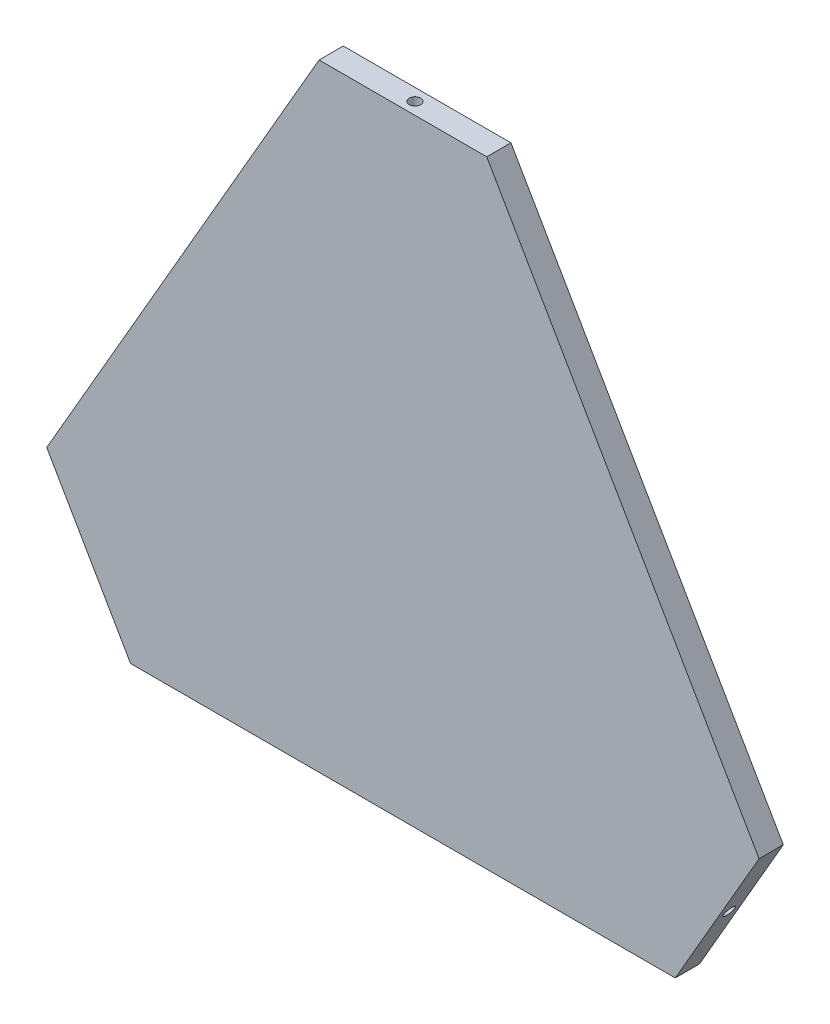
ISO-10303-21;
HEADER;
FILE_DESCRIPTION(('STEP AP214'),'2;1');
FILE_NAME('part.step','',(''),(''),'','','');
FILE_SCHEMA(('AUTOMOTIVE_DESIGN { 1 0 10303 214 1 1 1 1 }'));
ENDSEC;
DATA;
#1=APPLICATION_CONTEXT('core data for automotive mechanical design processes');
#2=APPLICATION_PROTOCOL_DEFINITION('international standard','automotive_design',2000,#1);
#3=PRODUCT_CONTEXT('',#1,'mechanical');
#4=PRODUCT('Part','Part','',(#3));
#5=PRODUCT_RELATED_PRODUCT_CATEGORY('part','',(#4));
#6=PRODUCT_DEFINITION_FORMATION('','',#4);
#7=PRODUCT_DEFINITION_CONTEXT('part definition',#1,'design');
#8=PRODUCT_DEFINITION('design','',#6,#7);
#9=PRODUCT_DEFINITION_SHAPE('','',#8);
#10=(LENGTH_UNIT() NAMED_UNIT(*) SI_UNIT(.MILLI.,.METRE.));
#11=(NAMED_UNIT(*) PLANE_ANGLE_UNIT() SI_UNIT($,.RADIAN.));
#12=(NAMED_UNIT(*) SI_UNIT($,.STERADIAN.) SOLID_ANGLE_UNIT());
#13=UNCERTAINTY_MEASURE_WITH_UNIT(LENGTH_MEASURE(1.E-05),#10,'distance_accuracy_value','');
#14=(GEOMETRIC_REPRESENTATION_CONTEXT(3) GLOBAL_UNCERTAINTY_ASSIGNED_CONTEXT((#13)) GLOBAL_UNIT_ASSIGNED_CONTEXT((#10,
#11,#12)) REPRESENTATION_CONTEXT('',''));
#15=CARTESIAN_POINT('',(0.,0.,0.));
#16=DIRECTION('',(0.,0.,1.));
#17=DIRECTION('',(1.,0.,0.));
#18=AXIS2_PLACEMENT_3D('',#15,#16,#17);
#19=CARTESIAN_POINT('',(0.,200.,6.35));
#20=DIRECTION('',(0.866025403784439,-0.5,0.));
#21=DIRECTION('',(0.5,0.866025403784439,0.));
#22=AXIS2_PLACEMENT_3D('',#19,#20,#21);
#23=PLANE('',#22);
#24=DIRECTION('',(-0.5,-0.866025403784439,0.));
#25=VECTOR('',#24,1.);
#26=CARTESIAN_POINT('',(0.,200.,0.));
#27=LINE('',#26,#25);
#28=CARTESIAN_POINT('',(-22.,161.894882233485,0.));
#29=VERTEX_POINT('',#28);
#30=CARTESIAN_POINT('',(-93.4700538379252,38.1051177665154,0.));
#31=VERTEX_POINT('',#30);
#32=EDGE_CURVE('E119',#29,#31,#27,.T.);
#33=ORIENTED_EDGE('',*,*,#32,.T.);
#34=DIRECTION('',(0.,0.,1.));
#35=VECTOR('',#34,1.);
#36=CARTESIAN_POINT('',(-93.4700538379252,38.1051177665153,0.));
#37=LINE('',#36,#35);
#38=CARTESIAN_POINT('',(-93.4700538379252,38.1051177665153,6.35));
#39=VERTEX_POINT('',#38);
#40=EDGE_CURVE('E99',#31,#39,#37,.T.);
#41=ORIENTED_EDGE('',*,*,#40,.T.);
#42=DIRECTION('',(-0.5,-0.866025403784439,0.));
#43=VECTOR('',#42,1.);
#44=CARTESIAN_POINT('',(0.,200.,6.35));
#45=LINE('',#44,#43);
#46=CARTESIAN_POINT('',(-22.,161.894882233485,6.35));
#47=VERTEX_POINT('',#46);
#48=EDGE_CURVE('E123',#47,#39,#45,.T.);
#49=ORIENTED_EDGE('',*,*,#48,.F.);
#50=DIRECTION('',(0.,0.,1.));
#51=VECTOR('',#50,1.);
#52=CARTESIAN_POINT('',(-22.,161.894882233485,0.));
#53=LINE('',#52,#51);
#54=EDGE_CURVE('E131',#29,#47,#53,.T.);
#55=ORIENTED_EDGE('',*,*,#54,.F.);
#56=EDGE_LOOP('',(#33,#41,#49,#55));
#57=FACE_BOUND('',#56,.T.);
#58=ADVANCED_FACE('F39',(#57),#23,.F.);
#59=CARTESIAN_POINT('',(-115.470053837925,0.,6.35));
#60=DIRECTION('',(0.,1.,0.));
#61=DIRECTION('',(-1.,0.,0.));
#62=AXIS2_PLACEMENT_3D('',#59,#60,#61);
#63=PLANE('',#62);
#64=DIRECTION('',(1.,0.,0.));
#65=VECTOR('',#64,1.);
#66=CARTESIAN_POINT('',(-115.470053837925,0.,6.35));
#67=LINE('',#66,#65);
#68=CARTESIAN_POINT('',(-71.4700538379252,0.,6.35));
#69=VERTEX_POINT('',#68);
#70=CARTESIAN_POINT('',(71.4700538379251,0.,6.35));
#71=VERTEX_POINT('',#70);
#72=EDGE_CURVE('E48',#69,#71,#67,.T.);
#73=ORIENTED_EDGE('',*,*,#72,.F.);
#74=DIRECTION('',(0.,0.,1.));
#75=VECTOR('',#74,1.);
#76=CARTESIAN_POINT('',(-71.4700538379252,0.,0.));
#77=LINE('',#76,#75);
#78=CARTESIAN_POINT('',(-71.4700538379252,0.,0.));
#79=VERTEX_POINT('',#78);
#80=EDGE_CURVE('E96',#79,#69,#77,.T.);
#81=ORIENTED_EDGE('',*,*,#80,.F.);
#82=DIRECTION('',(1.,0.,0.));
#83=VECTOR('',#82,1.);
#84=CARTESIAN_POINT('',(-115.470053837925,0.,0.));
#85=LINE('',#84,#83);
#86=CARTESIAN_POINT('',(71.470053837925,0.,0.));
#87=VERTEX_POINT('',#86);
#88=EDGE_CURVE('E111',#79,#87,#85,.T.);
#89=ORIENTED_EDGE('',*,*,#88,.T.);
#90=DIRECTION('',(0.,0.,1.));
#91=VECTOR('',#90,1.);
#92=CARTESIAN_POINT('',(71.4700538379251,0.,0.));
#93=LINE('',#92,#91);
#94=EDGE_CURVE('E56',#87,#71,#93,.T.);
#95=ORIENTED_EDGE('',*,*,#94,.T.);
#96=EDGE_LOOP('',(#73,#81,#89,#95));
#97=FACE_BOUND('',#96,.T.);
#98=ADVANCED_FACE('F110',(#97),#63,.F.);
#99=CARTESIAN_POINT('',(115.470053837925,0.,6.35));
#100=DIRECTION('',(-0.866025403784439,-0.5,0.));
#101=DIRECTION('',(0.5,-0.866025403784439,0.));
#102=AXIS2_PLACEMENT_3D('',#99,#100,#101);
#103=PLANE('',#102);
#104=DIRECTION('',(-0.5,0.866025403784439,0.));
#105=VECTOR('',#104,1.);
#106=CARTESIAN_POINT('',(115.470053837925,0.,6.35));
#107=LINE('',#106,#105);
#108=CARTESIAN_POINT('',(93.4700538379251,38.1051177665153,6.35));
#109=VERTEX_POINT('',#108);
#110=CARTESIAN_POINT('',(22.,161.894882233485,6.35));
#111=VERTEX_POINT('',#110);
#112=EDGE_CURVE('E11',#109,#111,#107,.T.);
#113=ORIENTED_EDGE('',*,*,#112,.F.);
#114=DIRECTION('',(0.,0.,1.));
#115=VECTOR('',#114,1.);
#116=CARTESIAN_POINT('',(93.4700538379251,38.1051177665153,0.));
#117=LINE('',#116,#115);
#118=CARTESIAN_POINT('',(93.4700538379251,38.1051177665153,0.));
#119=VERTEX_POINT('',#118);
#120=EDGE_CURVE('E144',#119,#109,#117,.T.);
#121=ORIENTED_EDGE('',*,*,#120,.F.);
#122=DIRECTION('',(-0.5,0.866025403784439,0.));
#123=VECTOR('',#122,1.);
#124=CARTESIAN_POINT('',(115.470053837925,0.,0.));
#125=LINE('',#124,#123);
#126=CARTESIAN_POINT('',(22.,161.894882233485,0.));
#127=VERTEX_POINT('',#126);
#128=EDGE_CURVE('E42',#119,#127,#125,.T.);
#129=ORIENTED_EDGE('',*,*,#128,.T.);
#130=DIRECTION('',(0.,0.,1.));
#131=VECTOR('',#130,1.);
#132=CARTESIAN_POINT('',(22.,161.894882233485,0.));
#133=LINE('',#132,#131);
#134=EDGE_CURVE('E64',#127,#111,#133,.T.);
#135=ORIENTED_EDGE('',*,*,#134,.T.);
#136=EDGE_LOOP('',(#113,#121,#129,#135));
#137=FACE_BOUND('',#136,.T.);
#138=ADVANCED_FACE('F204',(#137),#103,.F.);
#139=CARTESIAN_POINT('',(0.,0.,6.35));
#140=DIRECTION('',(0.,0.,1.));
#141=DIRECTION('',(1.,0.,0.));
#142=AXIS2_PLACEMENT_3D('',#139,#140,#141);
#143=PLANE('',#142);
#144=DIRECTION('',(-0.5,0.866025403784439,0.));
#145=VECTOR('',#144,1.);
#146=CARTESIAN_POINT('',(-93.4700538379252,38.1051177665153,6.35));
#147=LINE('',#146,#145);
#148=EDGE_CURVE('E105',#69,#39,#147,.T.);
#149=ORIENTED_EDGE('',*,*,#148,.F.);
#150=ORIENTED_EDGE('',*,*,#72,.T.);
#151=DIRECTION('',(-0.500000000000001,-0.866025403784438,0.));
#152=VECTOR('',#151,1.);
#153=CARTESIAN_POINT('',(71.4700538379251,0.,6.35));
#154=LINE('',#153,#152);
#155=EDGE_CURVE('E137',#109,#71,#154,.T.);
#156=ORIENTED_EDGE('',*,*,#155,.F.);
#157=ORIENTED_EDGE('',*,*,#112,.T.);
#158=DIRECTION('',(1.,0.,0.));
#159=VECTOR('',#158,1.);
#160=CARTESIAN_POINT('',(-22.,161.894882233485,6.35));
#161=LINE('',#160,#159);
#162=EDGE_CURVE('E138',#47,#111,#161,.T.);
#163=ORIENTED_EDGE('',*,*,#162,.F.);
#164=ORIENTED_EDGE('',*,*,#48,.T.);
#165=EDGE_LOOP('',(#149,#150,#156,#157,#163,#164));
#166=FACE_BOUND('',#165,.T.);
#167=ADVANCED_FACE('F198',(#166),#143,.T.);
#168=CARTESIAN_POINT('',(0.,0.,0.));
#169=DIRECTION('',(0.,0.,1.));
#170=DIRECTION('',(1.,0.,0.));
#171=AXIS2_PLACEMENT_3D('',#168,#169,#170);
#172=PLANE('',#171);
#173=ORIENTED_EDGE('',*,*,#88,.F.);
#174=DIRECTION('',(-0.5,0.866025403784439,0.));
#175=VECTOR('',#174,1.);
#176=CARTESIAN_POINT('',(-93.4700538379252,38.1051177665153,0.));
#177=LINE('',#176,#175);
#178=EDGE_CURVE('E93',#79,#31,#177,.T.);
#179=ORIENTED_EDGE('',*,*,#178,.T.);
#180=ORIENTED_EDGE('',*,*,#32,.F.);
#181=DIRECTION('',(1.,0.,0.));
#182=VECTOR('',#181,1.);
#183=CARTESIAN_POINT('',(-22.,161.894882233485,0.));
#184=LINE('',#183,#182);
#185=EDGE_CURVE('E134',#29,#127,#184,.T.);
#186=ORIENTED_EDGE('',*,*,#185,.T.);
#187=ORIENTED_EDGE('',*,*,#128,.F.);
#188=DIRECTION('',(-0.500000000000001,-0.866025403784438,0.));
#189=VECTOR('',#188,1.);
#190=CARTESIAN_POINT('',(71.4700538379251,0.,0.));
#191=LINE('',#190,#189);
#192=EDGE_CURVE('E117',#119,#87,#191,.T.);
#193=ORIENTED_EDGE('',*,*,#192,.T.);
#194=EDGE_LOOP('',(#173,#179,#180,#186,#187,#193));
#195=FACE_BOUND('',#194,.T.);
#196=ADVANCED_FACE('F115',(#195),#172,.F.);
#197=CARTESIAN_POINT('',(-22.,161.894882233485,0.));
#198=DIRECTION('',(0.,-1.,0.));
#199=DIRECTION('',(0.,0.,-1.));
#200=AXIS2_PLACEMENT_3D('',#197,#198,#199);
#201=PLANE('',#200);
#202=CARTESIAN_POINT('',(0.,161.894882233485,3.175));
#203=DIRECTION('',(0.,1.,0.));
#204=DIRECTION('',(0.,0.,1.));
#205=AXIS2_PLACEMENT_3D('',#202,#203,#204);
#206=CIRCLE('',#205,1.5);
#207=CARTESIAN_POINT('',(0.,161.894882233485,4.675));
#208=VERTEX_POINT('',#207);
#209=EDGE_CURVE('E165',#208,#208,#206,.T.);
#210=ORIENTED_EDGE('',*,*,#209,.F.);
#211=EDGE_LOOP('',(#210));
#212=FACE_BOUND('',#211,.T.);
#213=ORIENTED_EDGE('',*,*,#162,.T.);
#214=ORIENTED_EDGE('',*,*,#134,.F.);
#215=ORIENTED_EDGE('',*,*,#185,.F.);
#216=ORIENTED_EDGE('',*,*,#54,.T.);
#217=EDGE_LOOP('',(#213,#214,#215,#216));
#218=FACE_BOUND('',#217,.T.);
#219=ADVANCED_FACE('F192',(#212,#218),#201,.F.);
#220=CARTESIAN_POINT('',(71.4700538379251,0.,0.));
#221=DIRECTION('',(-0.866025403784438,0.500000000000001,0.));
#222=DIRECTION('',(-0.500000000000001,-0.866025403784438,0.));
#223=AXIS2_PLACEMENT_3D('',#220,#221,#222);
#224=PLANE('',#223);
#225=CARTESIAN_POINT('',(82.4700538379251,19.0525588832576,3.175));
#226=DIRECTION('',(0.866025403784438,-0.500000000000001,0.));
#227=DIRECTION('',(0.500000000000001,0.866025403784438,0.));
#228=AXIS2_PLACEMENT_3D('',#225,#226,#227);
#229=CIRCLE('',#228,1.5);
#230=CARTESIAN_POINT('',(83.2200538379251,20.3515969889343,3.175));
#231=VERTEX_POINT('',#230);
#232=EDGE_CURVE('E173',#231,#231,#229,.T.);
#233=ORIENTED_EDGE('',*,*,#232,.F.);
#234=EDGE_LOOP('',(#233));
#235=FACE_BOUND('',#234,.T.);
#236=ORIENTED_EDGE('',*,*,#155,.T.);
#237=ORIENTED_EDGE('',*,*,#94,.F.);
#238=ORIENTED_EDGE('',*,*,#192,.F.);
#239=ORIENTED_EDGE('',*,*,#120,.T.);
#240=EDGE_LOOP('',(#236,#237,#238,#239));
#241=FACE_BOUND('',#240,.T.);
#242=ADVANCED_FACE('F190',(#235,#241),#224,.F.);
#243=CARTESIAN_POINT('',(-93.4700538379252,38.1051177665153,0.));
#244=DIRECTION('',(0.866025403784439,0.5,0.));
#245=DIRECTION('',(-0.5,0.866025403784439,0.));
#246=AXIS2_PLACEMENT_3D('',#243,#244,#245);
#247=PLANE('',#246);
#248=CARTESIAN_POINT('',(-82.4700538379252,19.0525588832577,3.175));
#249=DIRECTION('',(-0.866025403784439,-0.5,0.));
#250=DIRECTION('',(0.5,-0.866025403784439,0.));
#251=AXIS2_PLACEMENT_3D('',#248,#249,#250);
#252=CIRCLE('',#251,1.5);
#253=CARTESIAN_POINT('',(-81.7200538379252,17.753520777581,3.175));
#254=VERTEX_POINT('',#253);
#255=EDGE_CURVE('E157',#254,#254,#252,.T.);
#256=ORIENTED_EDGE('',*,*,#255,.F.);
#257=EDGE_LOOP('',(#256));
#258=FACE_BOUND('',#257,.T.);
#259=ORIENTED_EDGE('',*,*,#148,.T.);
#260=ORIENTED_EDGE('',*,*,#40,.F.);
#261=ORIENTED_EDGE('',*,*,#178,.F.);
#262=ORIENTED_EDGE('',*,*,#80,.T.);
#263=EDGE_LOOP('',(#259,#260,#261,#262));
#264=FACE_BOUND('',#263,.T.);
#265=ADVANCED_FACE('F95',(#258,#264),#247,.F.);
#266=CARTESIAN_POINT('',(-78.139926819003,21.5525588832577,3.175));
#267=DIRECTION('',(-0.866025403784439,-0.5,0.));
#268=DIRECTION('',(0.5,-0.866025403784439,0.));
#269=AXIS2_PLACEMENT_3D('',#266,#267,#268);
#270=CYLINDRICAL_SURFACE('',#269,1.5);
#271=CARTESIAN_POINT('',(-78.139926819003,21.5525588832577,3.175));
#272=DIRECTION('',(-0.866025403784439,-0.5,0.));
#273=DIRECTION('',(0.5,-0.866025403784439,0.));
#274=AXIS2_PLACEMENT_3D('',#271,#272,#273);
#275=CIRCLE('',#274,1.5);
#276=CARTESIAN_POINT('',(-77.389926819003,20.253520777581,3.175));
#277=VERTEX_POINT('',#276);
#278=EDGE_CURVE('E141',#277,#277,#275,.T.);
#279=ORIENTED_EDGE('',*,*,#278,.F.);
#280=EDGE_LOOP('',(#279));
#281=FACE_BOUND('',#280,.T.);
#282=ORIENTED_EDGE('',*,*,#255,.T.);
#283=EDGE_LOOP('',(#282));
#284=FACE_BOUND('',#283,.T.);
#285=ADVANCED_FACE('F241',(#281,#284),#270,.F.);
#286=CARTESIAN_POINT('',(-78.139926819003,21.5525588832577,3.175));
#287=DIRECTION('',(-0.866025403784439,-0.5,0.));
#288=DIRECTION('',(0.5,-0.866025403784439,0.));
#289=AXIS2_PLACEMENT_3D('',#286,#287,#288);
#290=PLANE('',#289);
#291=ORIENTED_EDGE('',*,*,#278,.T.);
#292=EDGE_LOOP('',(#291));
#293=FACE_BOUND('',#292,.T.);
#294=ADVANCED_FACE('F252',(#293),#290,.T.);
#295=CARTESIAN_POINT('',(0.,156.894882233485,3.175));
#296=DIRECTION('',(0.,1.,0.));
#297=DIRECTION('',(0.,0.,1.));
#298=AXIS2_PLACEMENT_3D('',#295,#296,#297);
#299=CYLINDRICAL_SURFACE('',#298,1.5);
#300=CARTESIAN_POINT('',(0.,156.894882233485,3.175));
#301=DIRECTION('',(0.,1.,0.));
#302=DIRECTION('',(0.,0.,1.));
#303=AXIS2_PLACEMENT_3D('',#300,#301,#302);
#304=CIRCLE('',#303,1.5);
#305=CARTESIAN_POINT('',(0.,156.894882233485,4.675));
#306=VERTEX_POINT('',#305);
#307=EDGE_CURVE('E161',#306,#306,#304,.T.);
#308=ORIENTED_EDGE('',*,*,#307,.F.);
#309=EDGE_LOOP('',(#308));
#310=FACE_BOUND('',#309,.T.);
#311=ORIENTED_EDGE('',*,*,#209,.T.);
#312=EDGE_LOOP('',(#311));
#313=FACE_BOUND('',#312,.T.);
#314=ADVANCED_FACE('F261',(#310,#313),#299,.F.);
#315=CARTESIAN_POINT('',(0.,156.894882233485,3.175));
#316=DIRECTION('',(0.,1.,0.));
#317=DIRECTION('',(0.,0.,1.));
#318=AXIS2_PLACEMENT_3D('',#315,#316,#317);
#319=PLANE('',#318);
#320=ORIENTED_EDGE('',*,*,#307,.T.);
#321=EDGE_LOOP('',(#320));
#322=FACE_BOUND('',#321,.T.);
#323=ADVANCED_FACE('F186',(#322),#319,.T.);
#324=CARTESIAN_POINT('',(78.139926819003,21.5525588832576,3.175));
#325=DIRECTION('',(0.866025403784438,-0.500000000000001,0.));
#326=DIRECTION('',(0.500000000000001,0.866025403784438,0.));
#327=AXIS2_PLACEMENT_3D('',#324,#325,#326);
#328=CYLINDRICAL_SURFACE('',#327,1.5);
#329=CARTESIAN_POINT('',(78.139926819003,21.5525588832576,3.175));
#330=DIRECTION('',(0.866025403784438,-0.500000000000001,0.));
#331=DIRECTION('',(0.500000000000001,0.866025403784438,0.));
#332=AXIS2_PLACEMENT_3D('',#329,#330,#331);
#333=CIRCLE('',#332,1.5);
#334=CARTESIAN_POINT('',(78.889926819003,22.8515969889343,3.175));
#335=VERTEX_POINT('',#334);
#336=EDGE_CURVE('E169',#335,#335,#333,.T.);
#337=ORIENTED_EDGE('',*,*,#336,.F.);
#338=EDGE_LOOP('',(#337));
#339=FACE_BOUND('',#338,.T.);
#340=ORIENTED_EDGE('',*,*,#232,.T.);
#341=EDGE_LOOP('',(#340));
#342=FACE_BOUND('',#341,.T.);
#343=ADVANCED_FACE('F183',(#339,#342),#328,.F.);
#344=CARTESIAN_POINT('',(78.139926819003,21.5525588832576,3.175));
#345=DIRECTION('',(0.866025403784438,-0.500000000000001,0.));
#346=DIRECTION('',(0.500000000000001,0.866025403784438,0.));
#347=AXIS2_PLACEMENT_3D('',#344,#345,#346);
#348=PLANE('',#347);
#349=ORIENTED_EDGE('',*,*,#336,.T.);
#350=EDGE_LOOP('',(#349));
#351=FACE_BOUND('',#350,.T.);
#352=ADVANCED_FACE('F181',(#351),#348,.T.);
#353=CLOSED_SHELL('',(#58,#98,#138,#167,#196,#219,#242,#265,#285,#294,#314,#323,#343,#352));
#354=MANIFOLD_SOLID_BREP('B2',#353);
#355=ADVANCED_BREP_SHAPE_REPRESENTATION('',(#18,#354),#14);
#356=SHAPE_DEFINITION_REPRESENTATION(#9,#355);
ENDSEC;
END-ISO-10303-21;
